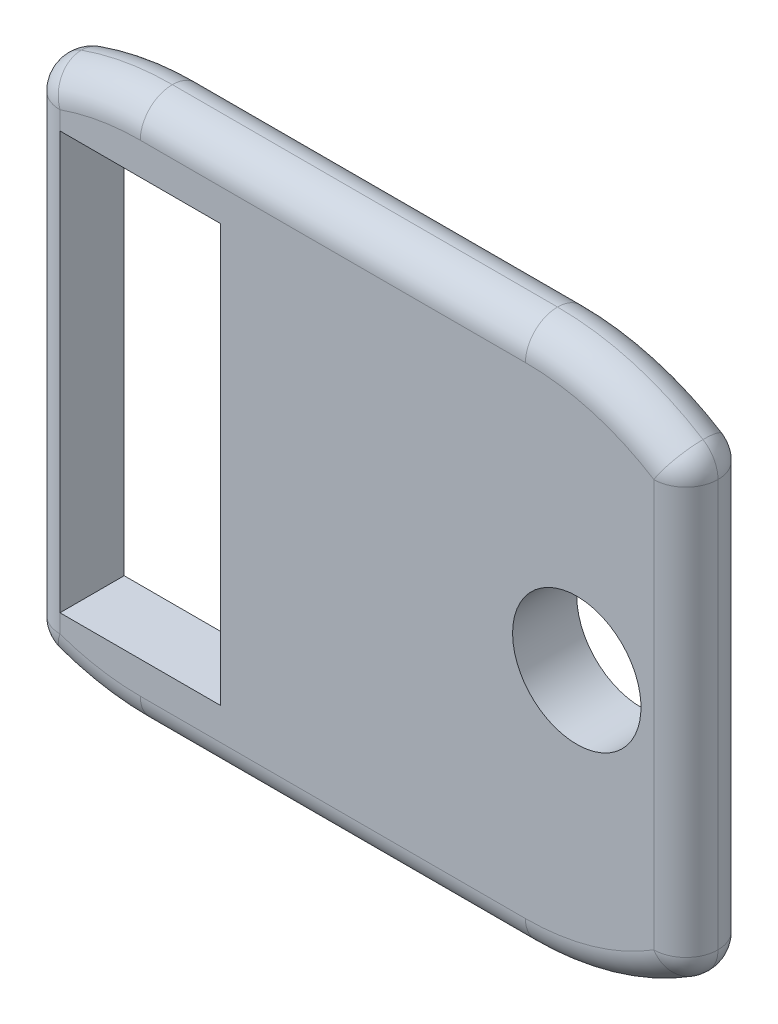
ISO-10303-21;
HEADER;
FILE_DESCRIPTION(('STEP AP214'),'2;1');
FILE_NAME('part.step','',(''),(''),'','','');
FILE_SCHEMA(('AUTOMOTIVE_DESIGN { 1 0 10303 214 1 1 1 1 }'));
ENDSEC;
DATA;
#1=APPLICATION_CONTEXT('core data for automotive mechanical design processes');
#2=APPLICATION_PROTOCOL_DEFINITION('international standard','automotive_design',2000,#1);
#3=PRODUCT_CONTEXT('',#1,'mechanical');
#4=PRODUCT('Part','Part','',(#3));
#5=PRODUCT_RELATED_PRODUCT_CATEGORY('part','',(#4));
#6=PRODUCT_DEFINITION_FORMATION('','',#4);
#7=PRODUCT_DEFINITION_CONTEXT('part definition',#1,'design');
#8=PRODUCT_DEFINITION('design','',#6,#7);
#9=PRODUCT_DEFINITION_SHAPE('','',#8);
#10=(LENGTH_UNIT() NAMED_UNIT(*) SI_UNIT(.MILLI.,.METRE.));
#11=(NAMED_UNIT(*) PLANE_ANGLE_UNIT() SI_UNIT($,.RADIAN.));
#12=(NAMED_UNIT(*) SI_UNIT($,.STERADIAN.) SOLID_ANGLE_UNIT());
#13=UNCERTAINTY_MEASURE_WITH_UNIT(LENGTH_MEASURE(1.E-05),#10,'distance_accuracy_value','');
#14=(GEOMETRIC_REPRESENTATION_CONTEXT(3) GLOBAL_UNCERTAINTY_ASSIGNED_CONTEXT((#13)) GLOBAL_UNIT_ASSIGNED_CONTEXT((#10,
#11,#12)) REPRESENTATION_CONTEXT('',''));
#15=CARTESIAN_POINT('',(0.,0.,0.));
#16=DIRECTION('',(0.,0.,1.));
#17=DIRECTION('',(1.,0.,0.));
#18=AXIS2_PLACEMENT_3D('',#15,#16,#17);
#19=CARTESIAN_POINT('',(8.67572678716883,-27.4690515955081,10.));
#20=DIRECTION('',(0.,0.,-1.));
#21=DIRECTION('',(-1.,0.,0.));
#22=AXIS2_PLACEMENT_3D('',#19,#20,#21);
#23=PLANE('',#22);
#24=DIRECTION('',(-1.,0.,0.));
#25=VECTOR('',#24,1.);
#26=CARTESIAN_POINT('',(8.67572678716883,-59.9690515955081,10.));
#27=LINE('',#26,#25);
#28=CARTESIAN_POINT('',(-38.8242732128312,-59.9690515955081,10.));
#29=VERTEX_POINT('',#28);
#30=CARTESIAN_POINT('',(-63.8242732128312,-59.9690515955081,10.));
#31=VERTEX_POINT('',#30);
#32=EDGE_CURVE('E322',#29,#31,#27,.T.);
#33=ORIENTED_EDGE('',*,*,#32,.T.);
#34=DIRECTION('',(0.,-1.,0.));
#35=VECTOR('',#34,1.);
#36=CARTESIAN_POINT('',(-63.8242732128312,-27.4690515955081,10.));
#37=LINE('',#36,#35);
#38=CARTESIAN_POINT('',(-63.8242732128312,-62.8243906548355,10.));
#39=VERTEX_POINT('',#38);
#40=EDGE_CURVE('E345',#31,#39,#37,.T.);
#41=ORIENTED_EDGE('',*,*,#40,.T.);
#42=CARTESIAN_POINT('',(-51.3242732128312,-27.4690515955081,10.));
#43=DIRECTION('',(0.,0.,-1.));
#44=DIRECTION('',(-1.,0.,0.));
#45=AXIS2_PLACEMENT_3D('',#42,#43,#44);
#46=CIRCLE('',#45,37.5);
#47=CARTESIAN_POINT('',(-51.3242732128312,-64.9690515955081,10.));
#48=VERTEX_POINT('',#47);
#49=EDGE_CURVE('E342',#39,#48,#46,.F.);
#50=ORIENTED_EDGE('',*,*,#49,.T.);
#51=DIRECTION('',(1.,0.,0.));
#52=VECTOR('',#51,1.);
#53=CARTESIAN_POINT('',(8.67572678716883,-64.9690515955081,10.));
#54=LINE('',#53,#52);
#55=CARTESIAN_POINT('',(8.67572678716883,-64.9690515955081,10.));
#56=VERTEX_POINT('',#55);
#57=EDGE_CURVE('E340',#48,#56,#54,.T.);
#58=ORIENTED_EDGE('',*,*,#57,.T.);
#59=CARTESIAN_POINT('',(8.67572678716883,-27.4690515955081,10.));
#60=DIRECTION('',(0.,0.,-1.));
#61=DIRECTION('',(-1.,0.,0.));
#62=AXIS2_PLACEMENT_3D('',#59,#60,#61);
#63=CIRCLE('',#62,37.5);
#64=CARTESIAN_POINT('',(28.6757267871688,-59.1904954466319,10.));
#65=VERTEX_POINT('',#64);
#66=EDGE_CURVE('E338',#56,#65,#63,.F.);
#67=ORIENTED_EDGE('',*,*,#66,.T.);
#68=DIRECTION('',(0.,1.,0.));
#69=VECTOR('',#68,1.);
#70=CARTESIAN_POINT('',(28.6757267871688,-27.4690515955081,10.));
#71=LINE('',#70,#69);
#72=CARTESIAN_POINT('',(28.6757267871688,4.25239225561575,10.));
#73=VERTEX_POINT('',#72);
#74=EDGE_CURVE('E336',#65,#73,#71,.T.);
#75=ORIENTED_EDGE('',*,*,#74,.T.);
#76=CARTESIAN_POINT('',(8.67572678716883,-27.4690515955081,10.));
#77=DIRECTION('',(0.,0.,-1.));
#78=DIRECTION('',(-1.,0.,0.));
#79=AXIS2_PLACEMENT_3D('',#76,#77,#78);
#80=CIRCLE('',#79,37.5);
#81=CARTESIAN_POINT('',(8.67572678716883,10.030948404492,10.));
#82=VERTEX_POINT('',#81);
#83=EDGE_CURVE('E334',#73,#82,#80,.F.);
#84=ORIENTED_EDGE('',*,*,#83,.T.);
#85=DIRECTION('',(-1.,0.,0.));
#86=VECTOR('',#85,1.);
#87=CARTESIAN_POINT('',(8.67572678716883,10.030948404492,10.));
#88=LINE('',#87,#86);
#89=CARTESIAN_POINT('',(-51.3242732128312,10.030948404492,10.));
#90=VERTEX_POINT('',#89);
#91=EDGE_CURVE('E330',#82,#90,#88,.T.);
#92=ORIENTED_EDGE('',*,*,#91,.T.);
#93=CARTESIAN_POINT('',(-51.3242732128312,-27.4690515955081,10.));
#94=DIRECTION('',(0.,0.,-1.));
#95=DIRECTION('',(-1.,0.,0.));
#96=AXIS2_PLACEMENT_3D('',#93,#94,#95);
#97=CIRCLE('',#96,37.5);
#98=CARTESIAN_POINT('',(-63.8242732128312,7.88628746381934,10.));
#99=VERTEX_POINT('',#98);
#100=EDGE_CURVE('E328',#90,#99,#97,.F.);
#101=ORIENTED_EDGE('',*,*,#100,.T.);
#102=DIRECTION('',(0.,-1.,0.));
#103=VECTOR('',#102,1.);
#104=CARTESIAN_POINT('',(-63.8242732128312,-27.4690515955081,10.));
#105=LINE('',#104,#103);
#106=CARTESIAN_POINT('',(-63.8242732128312,5.03094840449193,10.));
#107=VERTEX_POINT('',#106);
#108=EDGE_CURVE('E332',#99,#107,#105,.T.);
#109=ORIENTED_EDGE('',*,*,#108,.T.);
#110=DIRECTION('',(1.,0.,0.));
#111=VECTOR('',#110,1.);
#112=CARTESIAN_POINT('',(8.67572678716882,5.03094840449195,10.));
#113=LINE('',#112,#111);
#114=CARTESIAN_POINT('',(-38.8242732128312,5.03094840449194,10.));
#115=VERTEX_POINT('',#114);
#116=EDGE_CURVE('E311',#107,#115,#113,.T.);
#117=ORIENTED_EDGE('',*,*,#116,.T.);
#118=DIRECTION('',(0.,-1.,0.));
#119=VECTOR('',#118,1.);
#120=CARTESIAN_POINT('',(-38.8242732128312,-27.4690515955081,10.));
#121=LINE('',#120,#119);
#122=EDGE_CURVE('E319',#115,#29,#121,.T.);
#123=ORIENTED_EDGE('',*,*,#122,.T.);
#124=EDGE_LOOP('',(#33,#41,#50,#58,#67,#75,#84,#92,#101,#109,#117,#123));
#125=FACE_BOUND('',#124,.T.);
#126=CARTESIAN_POINT('',(16.6757267871688,-27.469051595508,10.));
#127=DIRECTION('',(0.,0.,-1.));
#128=DIRECTION('',(-1.,0.,0.));
#129=AXIS2_PLACEMENT_3D('',#126,#127,#128);
#130=CIRCLE('',#129,9.99999999999999);
#131=CARTESIAN_POINT('',(6.67572678716884,-27.469051595508,10.));
#132=VERTEX_POINT('',#131);
#133=EDGE_CURVE('E291',#132,#132,#130,.T.);
#134=ORIENTED_EDGE('',*,*,#133,.T.);
#135=EDGE_LOOP('',(#134));
#136=FACE_BOUND('',#135,.T.);
#137=ADVANCED_FACE('F33',(#125,#136),#23,.F.);
#138=CARTESIAN_POINT('',(8.67572678716883,-27.4690515955081,0.));
#139=DIRECTION('',(0.,0.,-1.));
#140=DIRECTION('',(-1.,0.,0.));
#141=AXIS2_PLACEMENT_3D('',#138,#139,#140);
#142=PLANE('',#141);
#143=CARTESIAN_POINT('',(16.6757267871688,-27.469051595508,0.));
#144=DIRECTION('',(0.,0.,-1.));
#145=DIRECTION('',(-1.,0.,0.));
#146=AXIS2_PLACEMENT_3D('',#143,#144,#145);
#147=CIRCLE('',#146,9.99999999999999);
#148=CARTESIAN_POINT('',(6.67572678716884,-27.469051595508,0.));
#149=VERTEX_POINT('',#148);
#150=EDGE_CURVE('E287',#149,#149,#147,.T.);
#151=ORIENTED_EDGE('',*,*,#150,.F.);
#152=EDGE_LOOP('',(#151));
#153=FACE_BOUND('',#152,.T.);
#154=CARTESIAN_POINT('',(-51.3242732128312,-27.4690515955081,0.));
#155=DIRECTION('',(0.,0.,-1.));
#156=DIRECTION('',(-1.,0.,0.));
#157=AXIS2_PLACEMENT_3D('',#154,#155,#156);
#158=CIRCLE('',#157,37.5);
#159=CARTESIAN_POINT('',(-51.3242732128312,-64.9690515955081,0.));
#160=VERTEX_POINT('',#159);
#161=CARTESIAN_POINT('',(-63.8242732128312,-62.8243906548355,0.));
#162=VERTEX_POINT('',#161);
#163=EDGE_CURVE('E43',#160,#162,#158,.T.);
#164=ORIENTED_EDGE('',*,*,#163,.T.);
#165=DIRECTION('',(0.,-1.,0.));
#166=VECTOR('',#165,1.);
#167=CARTESIAN_POINT('',(-63.8242732128312,11.2607818665661,0.));
#168=LINE('',#167,#166);
#169=CARTESIAN_POINT('',(-63.8242732128312,-59.9690515955081,0.));
#170=VERTEX_POINT('',#169);
#171=EDGE_CURVE('E11',#162,#170,#168,.F.);
#172=ORIENTED_EDGE('',*,*,#171,.T.);
#173=DIRECTION('',(-1.,0.,0.));
#174=VECTOR('',#173,1.);
#175=CARTESIAN_POINT('',(-38.8242732128312,-59.9690515955081,0.));
#176=LINE('',#175,#174);
#177=CARTESIAN_POINT('',(-38.8242732128312,-59.9690515955081,0.));
#178=VERTEX_POINT('',#177);
#179=EDGE_CURVE('E304',#178,#170,#176,.T.);
#180=ORIENTED_EDGE('',*,*,#179,.F.);
#181=DIRECTION('',(0.,-1.,0.));
#182=VECTOR('',#181,1.);
#183=CARTESIAN_POINT('',(-38.8242732128312,-59.9690515955081,0.));
#184=LINE('',#183,#182);
#185=CARTESIAN_POINT('',(-38.8242732128312,5.03094840449194,0.));
#186=VERTEX_POINT('',#185);
#187=EDGE_CURVE('E302',#186,#178,#184,.T.);
#188=ORIENTED_EDGE('',*,*,#187,.F.);
#189=DIRECTION('',(1.,0.,0.));
#190=VECTOR('',#189,1.);
#191=CARTESIAN_POINT('',(-38.8242732128312,5.03094840449194,0.));
#192=LINE('',#191,#190);
#193=CARTESIAN_POINT('',(-63.8242732128312,5.03094840449194,0.));
#194=VERTEX_POINT('',#193);
#195=EDGE_CURVE('E300',#194,#186,#192,.T.);
#196=ORIENTED_EDGE('',*,*,#195,.F.);
#197=DIRECTION('',(0.,-1.,0.));
#198=VECTOR('',#197,1.);
#199=CARTESIAN_POINT('',(-63.8242732128312,11.2607818665661,0.));
#200=LINE('',#199,#198);
#201=CARTESIAN_POINT('',(-63.8242732128312,7.88628746381934,0.));
#202=VERTEX_POINT('',#201);
#203=EDGE_CURVE('E351',#194,#202,#200,.F.);
#204=ORIENTED_EDGE('',*,*,#203,.T.);
#205=CARTESIAN_POINT('',(-51.3242732128312,-27.4690515955081,0.));
#206=DIRECTION('',(0.,0.,-1.));
#207=DIRECTION('',(-1.,0.,0.));
#208=AXIS2_PLACEMENT_3D('',#205,#206,#207);
#209=CIRCLE('',#208,37.5);
#210=CARTESIAN_POINT('',(-51.3242732128312,10.030948404492,0.));
#211=VERTEX_POINT('',#210);
#212=EDGE_CURVE('E347',#202,#211,#209,.T.);
#213=ORIENTED_EDGE('',*,*,#212,.T.);
#214=DIRECTION('',(-1.,0.,0.));
#215=VECTOR('',#214,1.);
#216=CARTESIAN_POINT('',(8.67572678716883,10.0309484044919,0.));
#217=LINE('',#216,#215);
#218=CARTESIAN_POINT('',(8.67572678716883,10.0309484044919,0.));
#219=VERTEX_POINT('',#218);
#220=EDGE_CURVE('E349',#211,#219,#217,.F.);
#221=ORIENTED_EDGE('',*,*,#220,.T.);
#222=CARTESIAN_POINT('',(8.67572678716883,-27.4690515955081,0.));
#223=DIRECTION('',(0.,0.,-1.));
#224=DIRECTION('',(-1.,0.,0.));
#225=AXIS2_PLACEMENT_3D('',#222,#223,#224);
#226=CIRCLE('',#225,37.5);
#227=CARTESIAN_POINT('',(28.6757267871688,4.25239225561575,0.));
#228=VERTEX_POINT('',#227);
#229=EDGE_CURVE('E353',#219,#228,#226,.T.);
#230=ORIENTED_EDGE('',*,*,#229,.T.);
#231=DIRECTION('',(0.,1.,0.));
#232=VECTOR('',#231,1.);
#233=CARTESIAN_POINT('',(28.6757267871688,-61.8383693076769,0.));
#234=LINE('',#233,#232);
#235=CARTESIAN_POINT('',(28.6757267871688,-59.1904954466319,0.));
#236=VERTEX_POINT('',#235);
#237=EDGE_CURVE('E175',#228,#236,#234,.F.);
#238=ORIENTED_EDGE('',*,*,#237,.T.);
#239=CARTESIAN_POINT('',(8.67572678716883,-27.4690515955081,0.));
#240=DIRECTION('',(0.,0.,-1.));
#241=DIRECTION('',(-1.,0.,0.));
#242=AXIS2_PLACEMENT_3D('',#239,#240,#241);
#243=CIRCLE('',#242,37.5);
#244=CARTESIAN_POINT('',(8.67572678716883,-64.9690515955081,0.));
#245=VERTEX_POINT('',#244);
#246=EDGE_CURVE('E167',#236,#245,#243,.T.);
#247=ORIENTED_EDGE('',*,*,#246,.T.);
#248=DIRECTION('',(1.,0.,0.));
#249=VECTOR('',#248,1.);
#250=CARTESIAN_POINT('',(-51.3242732128312,-64.9690515955081,0.));
#251=LINE('',#250,#249);
#252=EDGE_CURVE('E172',#245,#160,#251,.F.);
#253=ORIENTED_EDGE('',*,*,#252,.T.);
#254=EDGE_LOOP('',(#164,#172,#180,#188,#196,#204,#213,#221,#230,#238,#247,#253));
#255=FACE_BOUND('',#254,.T.);
#256=ADVANCED_FACE('F170',(#153,#255),#142,.T.);
#257=CARTESIAN_POINT('',(-63.8242732128312,-59.9690515955081,20.));
#258=DIRECTION('',(-1.,0.,0.));
#259=DIRECTION('',(0.,0.,1.));
#260=AXIS2_PLACEMENT_3D('',#257,#258,#259);
#261=PLANE('',#260);
#262=DIRECTION('',(0.,0.,-1.));
#263=VECTOR('',#262,1.);
#264=CARTESIAN_POINT('',(-63.8242732128312,-59.9690515955081,20.));
#265=LINE('',#264,#263);
#266=EDGE_CURVE('E308',#31,#170,#265,.T.);
#267=ORIENTED_EDGE('',*,*,#266,.T.);
#268=DIRECTION('',(0.,1.,0.));
#269=VECTOR('',#268,1.);
#270=CARTESIAN_POINT('',(-63.8242732128312,-59.9690515955081,0.));
#271=LINE('',#270,#269);
#272=EDGE_CURVE('E296',#170,#194,#271,.T.);
#273=ORIENTED_EDGE('',*,*,#272,.T.);
#274=DIRECTION('',(0.,0.,-1.));
#275=VECTOR('',#274,1.);
#276=CARTESIAN_POINT('',(-63.8242732128312,5.03094840449193,20.));
#277=LINE('',#276,#275);
#278=EDGE_CURVE('E307',#107,#194,#277,.T.);
#279=ORIENTED_EDGE('',*,*,#278,.F.);
#280=DIRECTION('',(0.,1.,0.));
#281=VECTOR('',#280,1.);
#282=CARTESIAN_POINT('',(-63.8242732128312,-27.4690515955081,10.));
#283=LINE('',#282,#281);
#284=EDGE_CURVE('E325',#31,#107,#283,.T.);
#285=ORIENTED_EDGE('',*,*,#284,.F.);
#286=EDGE_LOOP('',(#267,#273,#279,#285));
#287=FACE_BOUND('',#286,.T.);
#288=ADVANCED_FACE('F386',(#287),#261,.F.);
#289=CARTESIAN_POINT('',(-38.8242732128312,-59.9690515955081,20.));
#290=DIRECTION('',(0.,-1.,0.));
#291=DIRECTION('',(0.,0.,-1.));
#292=AXIS2_PLACEMENT_3D('',#289,#290,#291);
#293=PLANE('',#292);
#294=DIRECTION('',(0.,0.,-1.));
#295=VECTOR('',#294,1.);
#296=CARTESIAN_POINT('',(-38.8242732128312,-59.9690515955081,20.));
#297=LINE('',#296,#295);
#298=EDGE_CURVE('E312',#29,#178,#297,.T.);
#299=ORIENTED_EDGE('',*,*,#298,.T.);
#300=ORIENTED_EDGE('',*,*,#179,.T.);
#301=ORIENTED_EDGE('',*,*,#266,.F.);
#302=ORIENTED_EDGE('',*,*,#32,.F.);
#303=EDGE_LOOP('',(#299,#300,#301,#302));
#304=FACE_BOUND('',#303,.T.);
#305=ADVANCED_FACE('F389',(#304),#293,.F.);
#306=CARTESIAN_POINT('',(-38.8242732128312,-59.9690515955081,20.));
#307=DIRECTION('',(1.,0.,0.));
#308=DIRECTION('',(0.,0.,-1.));
#309=AXIS2_PLACEMENT_3D('',#306,#307,#308);
#310=PLANE('',#309);
#311=DIRECTION('',(0.,0.,-1.));
#312=VECTOR('',#311,1.);
#313=CARTESIAN_POINT('',(-38.8242732128312,5.03094840449194,20.));
#314=LINE('',#313,#312);
#315=EDGE_CURVE('E105',#115,#186,#314,.T.);
#316=ORIENTED_EDGE('',*,*,#315,.T.);
#317=ORIENTED_EDGE('',*,*,#187,.T.);
#318=ORIENTED_EDGE('',*,*,#298,.F.);
#319=ORIENTED_EDGE('',*,*,#122,.F.);
#320=EDGE_LOOP('',(#316,#317,#318,#319));
#321=FACE_BOUND('',#320,.T.);
#322=ADVANCED_FACE('F419',(#321),#310,.F.);
#323=CARTESIAN_POINT('',(-38.8242732128312,5.03094840449194,20.));
#324=DIRECTION('',(0.,1.,0.));
#325=DIRECTION('',(-1.,0.,0.));
#326=AXIS2_PLACEMENT_3D('',#323,#324,#325);
#327=PLANE('',#326);
#328=ORIENTED_EDGE('',*,*,#278,.T.);
#329=ORIENTED_EDGE('',*,*,#195,.T.);
#330=ORIENTED_EDGE('',*,*,#315,.F.);
#331=ORIENTED_EDGE('',*,*,#116,.F.);
#332=EDGE_LOOP('',(#328,#329,#330,#331));
#333=FACE_BOUND('',#332,.T.);
#334=ADVANCED_FACE('F418',(#333),#327,.F.);
#335=CARTESIAN_POINT('',(16.6757267871688,-27.469051595508,20.));
#336=DIRECTION('',(0.,0.,-1.));
#337=DIRECTION('',(-1.,0.,0.));
#338=AXIS2_PLACEMENT_3D('',#335,#336,#337);
#339=CYLINDRICAL_SURFACE('',#338,9.99999999999999);
#340=ORIENTED_EDGE('',*,*,#150,.T.);
#341=EDGE_LOOP('',(#340));
#342=FACE_BOUND('',#341,.T.);
#343=ORIENTED_EDGE('',*,*,#133,.F.);
#344=EDGE_LOOP('',(#343));
#345=FACE_BOUND('',#344,.T.);
#346=ADVANCED_FACE('F441',(#342,#345),#339,.F.);
#347=CARTESIAN_POINT('',(8.67572678716883,-27.4690515955081,5.));
#348=DIRECTION('',(0.,0.,-1.));
#349=DIRECTION('',(-1.,0.,0.));
#350=AXIS2_PLACEMENT_3D('',#347,#348,#349);
#351=TOROIDAL_SURFACE('',#350,37.5,5.);
#352=CARTESIAN_POINT('',(28.6757267871688,4.25239225561575,5.));
#353=DIRECTION('',(0.845905169363301,-0.533333333333333,0.));
#354=DIRECTION('',(0.533333333333333,0.845905169363301,0.));
#355=AXIS2_PLACEMENT_3D('',#352,#353,#354);
#356=CIRCLE('',#355,5.);
#357=CARTESIAN_POINT('',(31.3423934538355,8.48191810243225,5.));
#358=VERTEX_POINT('',#357);
#359=EDGE_CURVE('E281',#228,#358,#356,.T.);
#360=ORIENTED_EDGE('',*,*,#359,.F.);
#361=ORIENTED_EDGE('',*,*,#229,.F.);
#362=CARTESIAN_POINT('',(8.67572678716883,10.0309484044919,5.));
#363=DIRECTION('',(-1.,0.,0.));
#364=DIRECTION('',(0.,0.,1.));
#365=AXIS2_PLACEMENT_3D('',#362,#363,#364);
#366=CIRCLE('',#365,5.);
#367=CARTESIAN_POINT('',(8.67572678716883,15.0309484044919,5.));
#368=VERTEX_POINT('',#367);
#369=EDGE_CURVE('E37',#368,#219,#366,.T.);
#370=ORIENTED_EDGE('',*,*,#369,.F.);
#371=CARTESIAN_POINT('',(8.67572678716883,-27.4690515955081,5.));
#372=DIRECTION('',(0.,0.,-1.));
#373=DIRECTION('',(-1.,0.,0.));
#374=AXIS2_PLACEMENT_3D('',#371,#372,#373);
#375=CIRCLE('',#374,42.5);
#376=EDGE_CURVE('E96',#358,#368,#375,.F.);
#377=ORIENTED_EDGE('',*,*,#376,.F.);
#378=EDGE_LOOP('',(#360,#361,#370,#377));
#379=FACE_BOUND('',#378,.T.);
#380=ADVANCED_FACE('F35',(#379),#351,.T.);
#381=CARTESIAN_POINT('',(-51.3242732128312,10.030948404492,5.));
#382=DIRECTION('',(1.,0.,0.));
#383=DIRECTION('',(0.,1.,0.));
#384=AXIS2_PLACEMENT_3D('',#381,#382,#383);
#385=CYLINDRICAL_SURFACE('',#384,5.);
#386=ORIENTED_EDGE('',*,*,#369,.T.);
#387=ORIENTED_EDGE('',*,*,#220,.F.);
#388=CARTESIAN_POINT('',(-51.3242732128312,10.030948404492,5.));
#389=DIRECTION('',(-1.,0.,0.));
#390=DIRECTION('',(0.,0.,1.));
#391=AXIS2_PLACEMENT_3D('',#388,#389,#390);
#392=CIRCLE('',#391,5.);
#393=CARTESIAN_POINT('',(-51.3242732128312,15.030948404492,5.));
#394=VERTEX_POINT('',#393);
#395=EDGE_CURVE('E278',#394,#211,#392,.T.);
#396=ORIENTED_EDGE('',*,*,#395,.F.);
#397=DIRECTION('',(-1.,0.,0.));
#398=VECTOR('',#397,1.);
#399=CARTESIAN_POINT('',(-51.3242732128312,15.030948404492,5.));
#400=LINE('',#399,#398);
#401=EDGE_CURVE('E275',#368,#394,#400,.T.);
#402=ORIENTED_EDGE('',*,*,#401,.F.);
#403=EDGE_LOOP('',(#386,#387,#396,#402));
#404=FACE_BOUND('',#403,.T.);
#405=ADVANCED_FACE('F434',(#404),#385,.T.);
#406=CARTESIAN_POINT('',(8.67572678716883,-27.4690515955081,5.));
#407=DIRECTION('',(0.,0.,-1.));
#408=DIRECTION('',(-1.,0.,0.));
#409=AXIS2_PLACEMENT_3D('',#406,#407,#408);
#410=TOROIDAL_SURFACE('',#409,37.5,5.);
#411=CARTESIAN_POINT('',(28.6757267871688,4.25239225561575,5.));
#412=DIRECTION('',(0.845905169363301,-0.533333333333333,0.));
#413=DIRECTION('',(0.533333333333333,0.845905169363302,0.));
#414=AXIS2_PLACEMENT_3D('',#411,#412,#413);
#415=CIRCLE('',#414,5.);
#416=EDGE_CURVE('E269',#358,#73,#415,.T.);
#417=ORIENTED_EDGE('',*,*,#416,.F.);
#418=ORIENTED_EDGE('',*,*,#376,.T.);
#419=CARTESIAN_POINT('',(8.67572678716883,10.0309484044919,5.));
#420=DIRECTION('',(-1.,0.,0.));
#421=DIRECTION('',(0.,0.,1.));
#422=AXIS2_PLACEMENT_3D('',#419,#420,#421);
#423=CIRCLE('',#422,5.);
#424=EDGE_CURVE('E272',#82,#368,#423,.T.);
#425=ORIENTED_EDGE('',*,*,#424,.F.);
#426=ORIENTED_EDGE('',*,*,#83,.F.);
#427=EDGE_LOOP('',(#417,#418,#425,#426));
#428=FACE_BOUND('',#427,.T.);
#429=ADVANCED_FACE('F430',(#428),#410,.T.);
#430=CARTESIAN_POINT('',(28.6757267871688,4.25239225561575,5.));
#431=DIRECTION('',(0.,0.,1.));
#432=DIRECTION('',(1.,0.,0.));
#433=AXIS2_PLACEMENT_3D('',#430,#431,#432);
#434=SPHERICAL_SURFACE('',#433,5.);
#435=ORIENTED_EDGE('',*,*,#359,.T.);
#436=CARTESIAN_POINT('',(28.6757267871688,4.25239225561575,5.));
#437=DIRECTION('',(0.,0.,1.));
#438=DIRECTION('',(1.,0.,0.));
#439=AXIS2_PLACEMENT_3D('',#436,#437,#438);
#440=CIRCLE('',#439,5.);
#441=CARTESIAN_POINT('',(33.6757267871688,4.25239225561575,5.));
#442=VERTEX_POINT('',#441);
#443=EDGE_CURVE('E267',#442,#358,#440,.T.);
#444=ORIENTED_EDGE('',*,*,#443,.F.);
#445=CARTESIAN_POINT('',(28.6757267871688,4.25239225561575,5.));
#446=DIRECTION('',(0.,1.,0.));
#447=DIRECTION('',(0.,0.,1.));
#448=AXIS2_PLACEMENT_3D('',#445,#446,#447);
#449=CIRCLE('',#448,5.);
#450=EDGE_CURVE('E264',#228,#442,#449,.F.);
#451=ORIENTED_EDGE('',*,*,#450,.F.);
#452=EDGE_LOOP('',(#435,#444,#451));
#453=FACE_BOUND('',#452,.T.);
#454=ADVANCED_FACE('F356',(#453),#434,.T.);
#455=CARTESIAN_POINT('',(-51.3242732128312,-27.4690515955081,5.));
#456=DIRECTION('',(0.,0.,-1.));
#457=DIRECTION('',(-1.,0.,0.));
#458=AXIS2_PLACEMENT_3D('',#455,#456,#457);
#459=TOROIDAL_SURFACE('',#458,37.5,5.);
#460=ORIENTED_EDGE('',*,*,#395,.T.);
#461=ORIENTED_EDGE('',*,*,#212,.F.);
#462=CARTESIAN_POINT('',(-63.8242732128312,7.88628746381933,5.));
#463=DIRECTION('',(-0.942809041582064,-0.333333333333333,0.));
#464=DIRECTION('',(0.333333333333333,-0.942809041582064,0.));
#465=AXIS2_PLACEMENT_3D('',#462,#463,#464);
#466=CIRCLE('',#465,5.);
#467=CARTESIAN_POINT('',(-65.4909398794978,12.6003326717296,5.));
#468=VERTEX_POINT('',#467);
#469=EDGE_CURVE('E261',#468,#202,#466,.T.);
#470=ORIENTED_EDGE('',*,*,#469,.F.);
#471=CARTESIAN_POINT('',(-51.3242732128312,-27.4690515955081,5.));
#472=DIRECTION('',(0.,0.,-1.));
#473=DIRECTION('',(-1.,0.,0.));
#474=AXIS2_PLACEMENT_3D('',#471,#472,#473);
#475=CIRCLE('',#474,42.5);
#476=EDGE_CURVE('E255',#394,#468,#475,.F.);
#477=ORIENTED_EDGE('',*,*,#476,.F.);
#478=EDGE_LOOP('',(#460,#461,#470,#477));
#479=FACE_BOUND('',#478,.T.);
#480=ADVANCED_FACE('F397',(#479),#459,.T.);
#481=CARTESIAN_POINT('',(8.67572678716883,10.030948404492,5.));
#482=DIRECTION('',(-1.,0.,0.));
#483=DIRECTION('',(0.,-1.,0.));
#484=AXIS2_PLACEMENT_3D('',#481,#482,#483);
#485=CYLINDRICAL_SURFACE('',#484,5.);
#486=ORIENTED_EDGE('',*,*,#424,.T.);
#487=ORIENTED_EDGE('',*,*,#401,.T.);
#488=CARTESIAN_POINT('',(-51.3242732128312,10.030948404492,5.));
#489=DIRECTION('',(-1.,0.,0.));
#490=DIRECTION('',(0.,0.,1.));
#491=AXIS2_PLACEMENT_3D('',#488,#489,#490);
#492=CIRCLE('',#491,5.);
#493=EDGE_CURVE('E252',#90,#394,#492,.T.);
#494=ORIENTED_EDGE('',*,*,#493,.F.);
#495=ORIENTED_EDGE('',*,*,#91,.F.);
#496=EDGE_LOOP('',(#486,#487,#494,#495));
#497=FACE_BOUND('',#496,.T.);
#498=ADVANCED_FACE('F433',(#497),#485,.T.);
#499=CARTESIAN_POINT('',(28.6757267871688,4.25239225561575,5.));
#500=DIRECTION('',(0.,0.,1.));
#501=DIRECTION('',(1.,0.,0.));
#502=AXIS2_PLACEMENT_3D('',#499,#500,#501);
#503=SPHERICAL_SURFACE('',#502,5.);
#504=ORIENTED_EDGE('',*,*,#443,.T.);
#505=ORIENTED_EDGE('',*,*,#416,.T.);
#506=CARTESIAN_POINT('',(28.6757267871688,4.25239225561576,5.));
#507=DIRECTION('',(0.,1.,0.));
#508=DIRECTION('',(-1.,0.,0.));
#509=AXIS2_PLACEMENT_3D('',#506,#507,#508);
#510=CIRCLE('',#509,5.);
#511=EDGE_CURVE('E249',#442,#73,#510,.F.);
#512=ORIENTED_EDGE('',*,*,#511,.F.);
#513=EDGE_LOOP('',(#504,#505,#512));
#514=FACE_BOUND('',#513,.T.);
#515=ADVANCED_FACE('F429',(#514),#503,.T.);
#516=CARTESIAN_POINT('',(28.6757267871688,-61.8383693076769,5.));
#517=DIRECTION('',(0.,-1.,0.));
#518=DIRECTION('',(0.,0.,-1.));
#519=AXIS2_PLACEMENT_3D('',#516,#517,#518);
#520=CYLINDRICAL_SURFACE('',#519,5.);
#521=ORIENTED_EDGE('',*,*,#237,.F.);
#522=ORIENTED_EDGE('',*,*,#450,.T.);
#523=DIRECTION('',(0.,1.,0.));
#524=VECTOR('',#523,1.);
#525=CARTESIAN_POINT('',(33.6757267871688,6.90026611666074,5.));
#526=LINE('',#525,#524);
#527=CARTESIAN_POINT('',(33.6757267871688,-59.1904954466319,5.));
#528=VERTEX_POINT('',#527);
#529=EDGE_CURVE('E246',#528,#442,#526,.T.);
#530=ORIENTED_EDGE('',*,*,#529,.F.);
#531=CARTESIAN_POINT('',(28.6757267871688,-59.1904954466319,5.));
#532=DIRECTION('',(0.,-1.,0.));
#533=DIRECTION('',(1.,0.,0.));
#534=AXIS2_PLACEMENT_3D('',#531,#532,#533);
#535=CIRCLE('',#534,5.);
#536=EDGE_CURVE('E243',#236,#528,#535,.T.);
#537=ORIENTED_EDGE('',*,*,#536,.F.);
#538=EDGE_LOOP('',(#521,#522,#530,#537));
#539=FACE_BOUND('',#538,.T.);
#540=ADVANCED_FACE('F359',(#539),#520,.T.);
#541=CARTESIAN_POINT('',(-63.8242732128312,7.88628746381934,5.));
#542=DIRECTION('',(0.,0.,1.));
#543=DIRECTION('',(1.,0.,0.));
#544=AXIS2_PLACEMENT_3D('',#541,#542,#543);
#545=SPHERICAL_SURFACE('',#544,5.);
#546=CARTESIAN_POINT('',(-63.8242732128312,7.88628746381934,5.));
#547=DIRECTION('',(0.,0.,-1.));
#548=DIRECTION('',(-1.,0.,0.));
#549=AXIS2_PLACEMENT_3D('',#546,#547,#548);
#550=CIRCLE('',#549,5.);
#551=CARTESIAN_POINT('',(-68.8242732128312,7.88628746381934,5.));
#552=VERTEX_POINT('',#551);
#553=EDGE_CURVE('E258',#468,#552,#550,.F.);
#554=ORIENTED_EDGE('',*,*,#553,.F.);
#555=ORIENTED_EDGE('',*,*,#469,.T.);
#556=CARTESIAN_POINT('',(-63.8242732128312,7.88628746381934,5.));
#557=DIRECTION('',(0.,1.,0.));
#558=DIRECTION('',(-1.,0.,0.));
#559=AXIS2_PLACEMENT_3D('',#556,#557,#558);
#560=CIRCLE('',#559,5.);
#561=EDGE_CURVE('E240',#552,#202,#560,.F.);
#562=ORIENTED_EDGE('',*,*,#561,.F.);
#563=EDGE_LOOP('',(#554,#555,#562));
#564=FACE_BOUND('',#563,.T.);
#565=ADVANCED_FACE('F401',(#564),#545,.T.);
#566=CARTESIAN_POINT('',(-51.3242732128312,-27.4690515955081,5.));
#567=DIRECTION('',(0.,0.,-1.));
#568=DIRECTION('',(-1.,0.,0.));
#569=AXIS2_PLACEMENT_3D('',#566,#567,#568);
#570=TOROIDAL_SURFACE('',#569,37.5,5.);
#571=ORIENTED_EDGE('',*,*,#493,.T.);
#572=ORIENTED_EDGE('',*,*,#476,.T.);
#573=CARTESIAN_POINT('',(-63.8242732128312,7.88628746381934,5.));
#574=DIRECTION('',(-0.942809041582063,-0.333333333333333,0.));
#575=DIRECTION('',(0.333333333333333,-0.942809041582063,0.));
#576=AXIS2_PLACEMENT_3D('',#573,#574,#575);
#577=CIRCLE('',#576,5.);
#578=EDGE_CURVE('E237',#99,#468,#577,.T.);
#579=ORIENTED_EDGE('',*,*,#578,.F.);
#580=ORIENTED_EDGE('',*,*,#100,.F.);
#581=EDGE_LOOP('',(#571,#572,#579,#580));
#582=FACE_BOUND('',#581,.T.);
#583=ADVANCED_FACE('F406',(#582),#570,.T.);
#584=CARTESIAN_POINT('',(28.6757267871688,-27.4690515955081,5.));
#585=DIRECTION('',(0.,1.,0.));
#586=DIRECTION('',(0.,0.,1.));
#587=AXIS2_PLACEMENT_3D('',#584,#585,#586);
#588=CYLINDRICAL_SURFACE('',#587,5.);
#589=CARTESIAN_POINT('',(28.6757267871688,-59.1904954466319,5.));
#590=DIRECTION('',(0.,-1.,0.));
#591=DIRECTION('',(0.,0.,-1.));
#592=AXIS2_PLACEMENT_3D('',#589,#590,#591);
#593=CIRCLE('',#592,5.);
#594=EDGE_CURVE('E234',#528,#65,#593,.T.);
#595=ORIENTED_EDGE('',*,*,#594,.F.);
#596=ORIENTED_EDGE('',*,*,#529,.T.);
#597=ORIENTED_EDGE('',*,*,#511,.T.);
#598=ORIENTED_EDGE('',*,*,#74,.F.);
#599=EDGE_LOOP('',(#595,#596,#597,#598));
#600=FACE_BOUND('',#599,.T.);
#601=ADVANCED_FACE('F427',(#600),#588,.T.);
#602=CARTESIAN_POINT('',(28.6757267871688,-59.1904954466319,5.));
#603=DIRECTION('',(0.,0.,1.));
#604=DIRECTION('',(1.,0.,0.));
#605=AXIS2_PLACEMENT_3D('',#602,#603,#604);
#606=SPHERICAL_SURFACE('',#605,5.);
#607=ORIENTED_EDGE('',*,*,#536,.T.);
#608=CARTESIAN_POINT('',(28.6757267871688,-59.1904954466319,5.));
#609=DIRECTION('',(0.,0.,1.));
#610=DIRECTION('',(1.,0.,0.));
#611=AXIS2_PLACEMENT_3D('',#608,#609,#610);
#612=CIRCLE('',#611,5.);
#613=CARTESIAN_POINT('',(31.3423934538355,-63.4200212934484,5.));
#614=VERTEX_POINT('',#613);
#615=EDGE_CURVE('E231',#614,#528,#612,.T.);
#616=ORIENTED_EDGE('',*,*,#615,.F.);
#617=CARTESIAN_POINT('',(28.6757267871688,-59.1904954466319,5.));
#618=DIRECTION('',(0.845905169363301,0.533333333333334,0.));
#619=DIRECTION('',(-0.533333333333334,0.845905169363301,0.));
#620=AXIS2_PLACEMENT_3D('',#617,#618,#619);
#621=CIRCLE('',#620,5.);
#622=EDGE_CURVE('E229',#236,#614,#621,.F.);
#623=ORIENTED_EDGE('',*,*,#622,.F.);
#624=EDGE_LOOP('',(#607,#616,#623));
#625=FACE_BOUND('',#624,.T.);
#626=ADVANCED_FACE('F362',(#625),#606,.T.);
#627=CARTESIAN_POINT('',(-63.8242732128312,-66.1988850575822,5.));
#628=DIRECTION('',(0.,1.,0.));
#629=DIRECTION('',(0.,0.,1.));
#630=AXIS2_PLACEMENT_3D('',#627,#628,#629);
#631=CYLINDRICAL_SURFACE('',#630,5.);
#632=ORIENTED_EDGE('',*,*,#272,.F.);
#633=ORIENTED_EDGE('',*,*,#171,.F.);
#634=CARTESIAN_POINT('',(-63.8242732128312,-62.8243906548355,5.));
#635=DIRECTION('',(0.,-1.,0.));
#636=DIRECTION('',(0.,0.,-1.));
#637=AXIS2_PLACEMENT_3D('',#634,#635,#636);
#638=CIRCLE('',#637,5.);
#639=CARTESIAN_POINT('',(-68.8242732128312,-62.8243906548355,5.));
#640=VERTEX_POINT('',#639);
#641=EDGE_CURVE('E227',#640,#162,#638,.T.);
#642=ORIENTED_EDGE('',*,*,#641,.F.);
#643=DIRECTION('',(0.,-1.,0.));
#644=VECTOR('',#643,1.);
#645=CARTESIAN_POINT('',(-68.8242732128312,-66.1988850575822,5.));
#646=LINE('',#645,#644);
#647=EDGE_CURVE('E221',#552,#640,#646,.T.);
#648=ORIENTED_EDGE('',*,*,#647,.F.);
#649=ORIENTED_EDGE('',*,*,#561,.T.);
#650=ORIENTED_EDGE('',*,*,#203,.F.);
#651=EDGE_LOOP('',(#632,#633,#642,#648,#649,#650));
#652=FACE_BOUND('',#651,.T.);
#653=ADVANCED_FACE('F392',(#652),#631,.T.);
#654=CARTESIAN_POINT('',(-63.8242732128312,7.88628746381934,5.));
#655=DIRECTION('',(0.,0.,1.));
#656=DIRECTION('',(1.,0.,0.));
#657=AXIS2_PLACEMENT_3D('',#654,#655,#656);
#658=SPHERICAL_SURFACE('',#657,5.);
#659=ORIENTED_EDGE('',*,*,#578,.T.);
#660=ORIENTED_EDGE('',*,*,#553,.T.);
#661=CARTESIAN_POINT('',(-63.8242732128312,7.88628746381934,5.));
#662=DIRECTION('',(0.,1.,0.));
#663=DIRECTION('',(0.,0.,1.));
#664=AXIS2_PLACEMENT_3D('',#661,#662,#663);
#665=CIRCLE('',#664,5.);
#666=EDGE_CURVE('E218',#99,#552,#665,.F.);
#667=ORIENTED_EDGE('',*,*,#666,.F.);
#668=EDGE_LOOP('',(#659,#660,#667));
#669=FACE_BOUND('',#668,.T.);
#670=ADVANCED_FACE('F409',(#669),#658,.T.);
#671=CARTESIAN_POINT('',(28.6757267871688,-59.1904954466319,5.));
#672=DIRECTION('',(0.,0.,1.));
#673=DIRECTION('',(1.,0.,0.));
#674=AXIS2_PLACEMENT_3D('',#671,#672,#673);
#675=SPHERICAL_SURFACE('',#674,5.);
#676=ORIENTED_EDGE('',*,*,#615,.T.);
#677=ORIENTED_EDGE('',*,*,#594,.T.);
#678=CARTESIAN_POINT('',(28.6757267871688,-59.1904954466319,5.));
#679=DIRECTION('',(0.845905169363301,0.533333333333334,0.));
#680=DIRECTION('',(-0.533333333333334,0.845905169363301,0.));
#681=AXIS2_PLACEMENT_3D('',#678,#679,#680);
#682=CIRCLE('',#681,5.);
#683=EDGE_CURVE('E215',#614,#65,#682,.F.);
#684=ORIENTED_EDGE('',*,*,#683,.F.);
#685=EDGE_LOOP('',(#676,#677,#684));
#686=FACE_BOUND('',#685,.T.);
#687=ADVANCED_FACE('F365',(#686),#675,.T.);
#688=CARTESIAN_POINT('',(8.67572678716883,-27.4690515955081,5.));
#689=DIRECTION('',(0.,0.,-1.));
#690=DIRECTION('',(-1.,0.,0.));
#691=AXIS2_PLACEMENT_3D('',#688,#689,#690);
#692=TOROIDAL_SURFACE('',#691,37.5,5.);
#693=ORIENTED_EDGE('',*,*,#246,.F.);
#694=ORIENTED_EDGE('',*,*,#622,.T.);
#695=CARTESIAN_POINT('',(8.67572678716883,-27.4690515955081,5.));
#696=DIRECTION('',(0.,0.,-1.));
#697=DIRECTION('',(-1.,0.,0.));
#698=AXIS2_PLACEMENT_3D('',#695,#696,#697);
#699=CIRCLE('',#698,42.5);
#700=CARTESIAN_POINT('',(8.67572678716883,-69.9690515955081,5.));
#701=VERTEX_POINT('',#700);
#702=EDGE_CURVE('E184',#701,#614,#699,.F.);
#703=ORIENTED_EDGE('',*,*,#702,.F.);
#704=CARTESIAN_POINT('',(8.67572678716883,-64.9690515955081,5.));
#705=DIRECTION('',(-1.,0.,0.));
#706=DIRECTION('',(0.,0.,1.));
#707=AXIS2_PLACEMENT_3D('',#704,#705,#706);
#708=CIRCLE('',#707,5.);
#709=EDGE_CURVE('E181',#245,#701,#708,.T.);
#710=ORIENTED_EDGE('',*,*,#709,.F.);
#711=EDGE_LOOP('',(#693,#694,#703,#710));
#712=FACE_BOUND('',#711,.T.);
#713=ADVANCED_FACE('F182',(#712),#692,.T.);
#714=CARTESIAN_POINT('',(-63.8242732128312,-62.8243906548355,5.));
#715=DIRECTION('',(0.,0.,1.));
#716=DIRECTION('',(1.,0.,0.));
#717=AXIS2_PLACEMENT_3D('',#714,#715,#716);
#718=SPHERICAL_SURFACE('',#717,5.);
#719=CARTESIAN_POINT('',(-63.8242732128312,-62.8243906548355,5.));
#720=DIRECTION('',(0.,0.,-1.));
#721=DIRECTION('',(-1.,0.,0.));
#722=AXIS2_PLACEMENT_3D('',#719,#720,#721);
#723=CIRCLE('',#722,5.);
#724=CARTESIAN_POINT('',(-65.4909398794978,-67.5384358627458,5.));
#725=VERTEX_POINT('',#724);
#726=EDGE_CURVE('E224',#640,#725,#723,.F.);
#727=ORIENTED_EDGE('',*,*,#726,.F.);
#728=ORIENTED_EDGE('',*,*,#641,.T.);
#729=CARTESIAN_POINT('',(-63.8242732128312,-62.8243906548355,5.));
#730=DIRECTION('',(-0.942809041582064,0.333333333333333,0.));
#731=DIRECTION('',(-0.333333333333333,-0.942809041582064,0.));
#732=AXIS2_PLACEMENT_3D('',#729,#730,#731);
#733=CIRCLE('',#732,5.);
#734=EDGE_CURVE('E52',#725,#162,#733,.F.);
#735=ORIENTED_EDGE('',*,*,#734,.F.);
#736=EDGE_LOOP('',(#727,#728,#735));
#737=FACE_BOUND('',#736,.T.);
#738=ADVANCED_FACE('F466',(#737),#718,.T.);
#739=CARTESIAN_POINT('',(-63.8242732128312,-27.4690515955081,5.));
#740=DIRECTION('',(0.,-1.,0.));
#741=DIRECTION('',(0.,0.,-1.));
#742=AXIS2_PLACEMENT_3D('',#739,#740,#741);
#743=CYLINDRICAL_SURFACE('',#742,5.);
#744=ORIENTED_EDGE('',*,*,#666,.T.);
#745=ORIENTED_EDGE('',*,*,#647,.T.);
#746=CARTESIAN_POINT('',(-63.8242732128312,-62.8243906548355,5.));
#747=DIRECTION('',(0.,-1.,0.));
#748=DIRECTION('',(0.,0.,-1.));
#749=AXIS2_PLACEMENT_3D('',#746,#747,#748);
#750=CIRCLE('',#749,5.);
#751=EDGE_CURVE('E209',#39,#640,#750,.T.);
#752=ORIENTED_EDGE('',*,*,#751,.F.);
#753=ORIENTED_EDGE('',*,*,#40,.F.);
#754=ORIENTED_EDGE('',*,*,#284,.T.);
#755=ORIENTED_EDGE('',*,*,#108,.F.);
#756=EDGE_LOOP('',(#744,#745,#752,#753,#754,#755));
#757=FACE_BOUND('',#756,.T.);
#758=ADVANCED_FACE('F412',(#757),#743,.T.);
#759=CARTESIAN_POINT('',(8.67572678716883,-27.4690515955081,5.));
#760=DIRECTION('',(0.,0.,-1.));
#761=DIRECTION('',(-1.,0.,0.));
#762=AXIS2_PLACEMENT_3D('',#759,#760,#761);
#763=TOROIDAL_SURFACE('',#762,37.5,5.);
#764=ORIENTED_EDGE('',*,*,#683,.T.);
#765=ORIENTED_EDGE('',*,*,#66,.F.);
#766=CARTESIAN_POINT('',(8.67572678716883,-64.9690515955081,5.));
#767=DIRECTION('',(-1.,0.,0.));
#768=DIRECTION('',(0.,0.,1.));
#769=AXIS2_PLACEMENT_3D('',#766,#767,#768);
#770=CIRCLE('',#769,5.);
#771=EDGE_CURVE('E206',#701,#56,#770,.T.);
#772=ORIENTED_EDGE('',*,*,#771,.F.);
#773=ORIENTED_EDGE('',*,*,#702,.T.);
#774=EDGE_LOOP('',(#764,#765,#772,#773));
#775=FACE_BOUND('',#774,.T.);
#776=ADVANCED_FACE('F369',(#775),#763,.T.);
#777=CARTESIAN_POINT('',(8.67572678716883,-64.9690515955081,5.));
#778=DIRECTION('',(-1.,0.,0.));
#779=DIRECTION('',(0.,0.,1.));
#780=AXIS2_PLACEMENT_3D('',#777,#778,#779);
#781=CYLINDRICAL_SURFACE('',#780,5.);
#782=CARTESIAN_POINT('',(-51.3242732128312,-64.9690515955081,5.));
#783=DIRECTION('',(-1.,0.,0.));
#784=DIRECTION('',(0.,0.,1.));
#785=AXIS2_PLACEMENT_3D('',#782,#783,#784);
#786=CIRCLE('',#785,5.);
#787=CARTESIAN_POINT('',(-51.3242732128312,-69.9690515955081,5.));
#788=VERTEX_POINT('',#787);
#789=EDGE_CURVE('E188',#160,#788,#786,.T.);
#790=ORIENTED_EDGE('',*,*,#789,.F.);
#791=ORIENTED_EDGE('',*,*,#252,.F.);
#792=ORIENTED_EDGE('',*,*,#709,.T.);
#793=DIRECTION('',(1.,0.,0.));
#794=VECTOR('',#793,1.);
#795=CARTESIAN_POINT('',(8.67572678716883,-69.9690515955081,5.));
#796=LINE('',#795,#794);
#797=EDGE_CURVE('E203',#788,#701,#796,.T.);
#798=ORIENTED_EDGE('',*,*,#797,.F.);
#799=EDGE_LOOP('',(#790,#791,#792,#798));
#800=FACE_BOUND('',#799,.T.);
#801=ADVANCED_FACE('F190',(#800),#781,.T.);
#802=CARTESIAN_POINT('',(-51.3242732128312,-27.4690515955081,5.));
#803=DIRECTION('',(0.,0.,-1.));
#804=DIRECTION('',(-1.,0.,0.));
#805=AXIS2_PLACEMENT_3D('',#802,#803,#804);
#806=TOROIDAL_SURFACE('',#805,37.5,5.);
#807=ORIENTED_EDGE('',*,*,#163,.F.);
#808=ORIENTED_EDGE('',*,*,#789,.T.);
#809=CARTESIAN_POINT('',(-51.3242732128312,-27.4690515955081,5.));
#810=DIRECTION('',(0.,0.,-1.));
#811=DIRECTION('',(-1.,0.,0.));
#812=AXIS2_PLACEMENT_3D('',#809,#810,#811);
#813=CIRCLE('',#812,42.5);
#814=EDGE_CURVE('E200',#725,#788,#813,.F.);
#815=ORIENTED_EDGE('',*,*,#814,.F.);
#816=ORIENTED_EDGE('',*,*,#734,.T.);
#817=EDGE_LOOP('',(#807,#808,#815,#816));
#818=FACE_BOUND('',#817,.T.);
#819=ADVANCED_FACE('F378',(#818),#806,.T.);
#820=CARTESIAN_POINT('',(-63.8242732128312,-62.8243906548355,5.));
#821=DIRECTION('',(0.,0.,1.));
#822=DIRECTION('',(1.,0.,0.));
#823=AXIS2_PLACEMENT_3D('',#820,#821,#822);
#824=SPHERICAL_SURFACE('',#823,5.);
#825=ORIENTED_EDGE('',*,*,#751,.T.);
#826=ORIENTED_EDGE('',*,*,#726,.T.);
#827=CARTESIAN_POINT('',(-63.8242732128312,-62.8243906548355,5.));
#828=DIRECTION('',(-0.942809041582064,0.333333333333333,0.));
#829=DIRECTION('',(-0.333333333333333,-0.942809041582064,0.));
#830=AXIS2_PLACEMENT_3D('',#827,#828,#829);
#831=CIRCLE('',#830,5.);
#832=EDGE_CURVE('E197',#39,#725,#831,.F.);
#833=ORIENTED_EDGE('',*,*,#832,.F.);
#834=EDGE_LOOP('',(#825,#826,#833));
#835=FACE_BOUND('',#834,.T.);
#836=ADVANCED_FACE('F422',(#835),#824,.T.);
#837=CARTESIAN_POINT('',(8.67572678716883,-64.9690515955081,5.));
#838=DIRECTION('',(1.,0.,0.));
#839=DIRECTION('',(0.,0.,-1.));
#840=AXIS2_PLACEMENT_3D('',#837,#838,#839);
#841=CYLINDRICAL_SURFACE('',#840,5.);
#842=ORIENTED_EDGE('',*,*,#771,.T.);
#843=ORIENTED_EDGE('',*,*,#57,.F.);
#844=CARTESIAN_POINT('',(-51.3242732128312,-64.9690515955081,5.));
#845=DIRECTION('',(-1.,0.,0.));
#846=DIRECTION('',(0.,0.,1.));
#847=AXIS2_PLACEMENT_3D('',#844,#845,#846);
#848=CIRCLE('',#847,5.);
#849=EDGE_CURVE('E195',#788,#48,#848,.T.);
#850=ORIENTED_EDGE('',*,*,#849,.F.);
#851=ORIENTED_EDGE('',*,*,#797,.T.);
#852=EDGE_LOOP('',(#842,#843,#850,#851));
#853=FACE_BOUND('',#852,.T.);
#854=ADVANCED_FACE('F373',(#853),#841,.T.);
#855=CARTESIAN_POINT('',(-51.3242732128312,-27.4690515955081,5.));
#856=DIRECTION('',(0.,0.,-1.));
#857=DIRECTION('',(-1.,0.,0.));
#858=AXIS2_PLACEMENT_3D('',#855,#856,#857);
#859=TOROIDAL_SURFACE('',#858,37.5,5.);
#860=ORIENTED_EDGE('',*,*,#832,.T.);
#861=ORIENTED_EDGE('',*,*,#814,.T.);
#862=ORIENTED_EDGE('',*,*,#849,.T.);
#863=ORIENTED_EDGE('',*,*,#49,.F.);
#864=EDGE_LOOP('',(#860,#861,#862,#863));
#865=FACE_BOUND('',#864,.T.);
#866=ADVANCED_FACE('F375',(#865),#859,.T.);
#867=CLOSED_SHELL('',(#137,#256,#288,#305,#322,#334,#346,#380,#405,#429,#454,#480,#498,#515,
#540,#565,#583,#601,#626,#653,#670,#687,#713,#738,#758,#776,#801,#819,#836,#854,#866));
#868=MANIFOLD_SOLID_BREP('B2',#867);
#869=ADVANCED_BREP_SHAPE_REPRESENTATION('',(#18,#868),#14);
#870=SHAPE_DEFINITION_REPRESENTATION(#9,#869);
ENDSEC;
END-ISO-10303-21;
